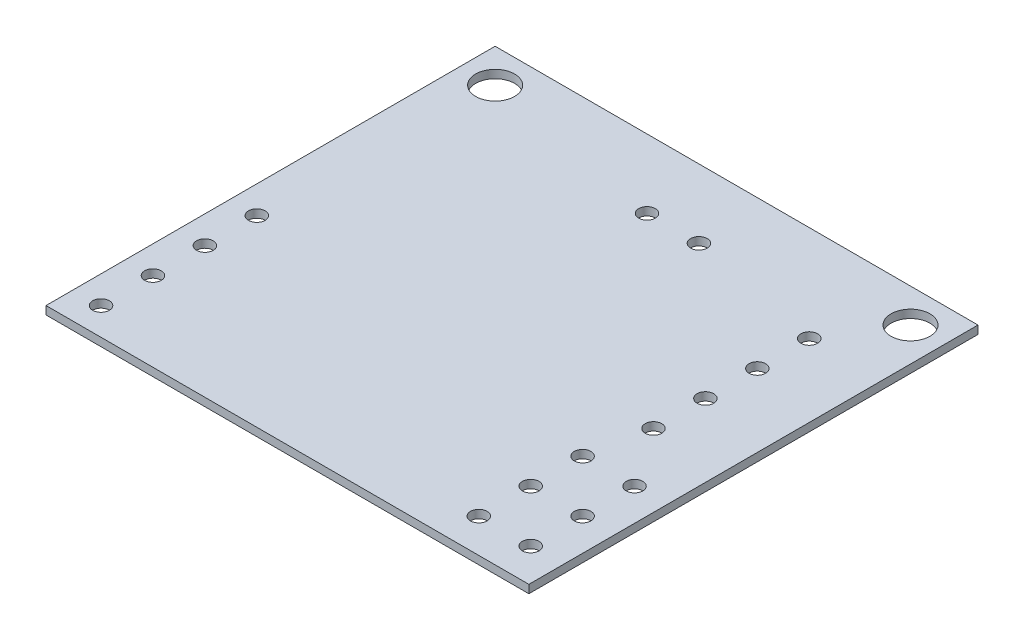
ISO-10303-21;
HEADER;
FILE_DESCRIPTION(('STEP AP214'),'2;1');
FILE_NAME('part.step','',(''),(''),'','','');
FILE_SCHEMA(('AUTOMOTIVE_DESIGN { 1 0 10303 214 1 1 1 1 }'));
ENDSEC;
DATA;
#1=APPLICATION_CONTEXT('core data for automotive mechanical design processes');
#2=APPLICATION_PROTOCOL_DEFINITION('international standard','automotive_design',2000,#1);
#3=PRODUCT_CONTEXT('',#1,'mechanical');
#4=PRODUCT('Part','Part','',(#3));
#5=PRODUCT_RELATED_PRODUCT_CATEGORY('part','',(#4));
#6=PRODUCT_DEFINITION_FORMATION('','',#4);
#7=PRODUCT_DEFINITION_CONTEXT('part definition',#1,'design');
#8=PRODUCT_DEFINITION('design','',#6,#7);
#9=PRODUCT_DEFINITION_SHAPE('','',#8);
#10=(LENGTH_UNIT() NAMED_UNIT(*) SI_UNIT(.MILLI.,.METRE.));
#11=(NAMED_UNIT(*) PLANE_ANGLE_UNIT() SI_UNIT($,.RADIAN.));
#12=(NAMED_UNIT(*) SI_UNIT($,.STERADIAN.) SOLID_ANGLE_UNIT());
#13=UNCERTAINTY_MEASURE_WITH_UNIT(LENGTH_MEASURE(1.E-05),#10,'distance_accuracy_value','');
#14=(GEOMETRIC_REPRESENTATION_CONTEXT(3) GLOBAL_UNCERTAINTY_ASSIGNED_CONTEXT((#13)) GLOBAL_UNIT_ASSIGNED_CONTEXT((#10,
#11,#12)) REPRESENTATION_CONTEXT('',''));
#15=CARTESIAN_POINT('',(0.,0.,0.));
#16=DIRECTION('',(0.,0.,1.));
#17=DIRECTION('',(1.,0.,0.));
#18=AXIS2_PLACEMENT_3D('',#15,#16,#17);
#19=CARTESIAN_POINT('',(0.,0.4,0.));
#20=DIRECTION('',(0.,-1.,0.));
#21=DIRECTION('',(0.,0.,-1.));
#22=AXIS2_PLACEMENT_3D('',#19,#20,#21);
#23=PLANE('',#22);
#24=DIRECTION('',(0.,0.,1.));
#25=VECTOR('',#24,1.);
#26=CARTESIAN_POINT('',(0.,0.4,0.));
#27=LINE('',#26,#25);
#28=CARTESIAN_POINT('',(0.,0.4,-21.971));
#29=VERTEX_POINT('',#28);
#30=CARTESIAN_POINT('',(0.,0.4,0.));
#31=VERTEX_POINT('',#30);
#32=EDGE_CURVE('E87',#29,#31,#27,.T.);
#33=ORIENTED_EDGE('',*,*,#32,.T.);
#34=DIRECTION('',(1.,0.,0.));
#35=VECTOR('',#34,1.);
#36=CARTESIAN_POINT('',(0.,0.4,0.));
#37=LINE('',#36,#35);
#38=CARTESIAN_POINT('',(23.622,0.4,0.));
#39=VERTEX_POINT('',#38);
#40=EDGE_CURVE('E82',#31,#39,#37,.T.);
#41=ORIENTED_EDGE('',*,*,#40,.T.);
#42=DIRECTION('',(0.,0.,-1.));
#43=VECTOR('',#42,1.);
#44=CARTESIAN_POINT('',(23.622,0.4,0.));
#45=LINE('',#44,#43);
#46=CARTESIAN_POINT('',(23.622,0.4,-21.971));
#47=VERTEX_POINT('',#46);
#48=EDGE_CURVE('E85',#39,#47,#45,.T.);
#49=ORIENTED_EDGE('',*,*,#48,.T.);
#50=DIRECTION('',(-1.,0.,0.));
#51=VECTOR('',#50,1.);
#52=CARTESIAN_POINT('',(0.,0.4,-21.971));
#53=LINE('',#52,#51);
#54=EDGE_CURVE('E52',#47,#29,#53,.T.);
#55=ORIENTED_EDGE('',*,*,#54,.T.);
#56=EDGE_LOOP('',(#33,#41,#49,#55));
#57=FACE_BOUND('',#56,.T.);
#58=CARTESIAN_POINT('',(1.651,0.4,-20.32));
#59=DIRECTION('',(0.,1.,0.));
#60=DIRECTION('',(0.,0.,1.));
#61=AXIS2_PLACEMENT_3D('',#58,#59,#60);
#62=CIRCLE('',#61,0.9525);
#63=CARTESIAN_POINT('',(1.651,0.4,-19.3675));
#64=VERTEX_POINT('',#63);
#65=EDGE_CURVE('E102',#64,#64,#62,.T.);
#66=ORIENTED_EDGE('',*,*,#65,.F.);
#67=EDGE_LOOP('',(#66));
#68=FACE_BOUND('',#67,.T.);
#69=CARTESIAN_POINT('',(21.971,0.4,-20.32));
#70=DIRECTION('',(0.,1.,0.));
#71=DIRECTION('',(0.,0.,1.));
#72=AXIS2_PLACEMENT_3D('',#69,#70,#71);
#73=CIRCLE('',#72,0.9525);
#74=CARTESIAN_POINT('',(21.971,0.4,-19.3675));
#75=VERTEX_POINT('',#74);
#76=EDGE_CURVE('E117',#75,#75,#73,.T.);
#77=ORIENTED_EDGE('',*,*,#76,.F.);
#78=EDGE_LOOP('',(#77));
#79=FACE_BOUND('',#78,.T.);
#80=CARTESIAN_POINT('',(13.335,0.4,-18.6055));
#81=DIRECTION('',(0.,1.,0.));
#82=DIRECTION('',(0.,0.,1.));
#83=AXIS2_PLACEMENT_3D('',#80,#81,#82);
#84=CIRCLE('',#83,0.406399999999999);
#85=CARTESIAN_POINT('',(13.335,0.4,-18.1991));
#86=VERTEX_POINT('',#85);
#87=EDGE_CURVE('E123',#86,#86,#84,.T.);
#88=ORIENTED_EDGE('',*,*,#87,.F.);
#89=EDGE_LOOP('',(#88));
#90=FACE_BOUND('',#89,.T.);
#91=CARTESIAN_POINT('',(10.795,0.4,-18.6055));
#92=DIRECTION('',(0.,1.,0.));
#93=DIRECTION('',(0.,0.,1.));
#94=AXIS2_PLACEMENT_3D('',#91,#92,#93);
#95=CIRCLE('',#94,0.406399999999999);
#96=CARTESIAN_POINT('',(10.795,0.4,-18.1991));
#97=VERTEX_POINT('',#96);
#98=EDGE_CURVE('E129',#97,#97,#95,.T.);
#99=ORIENTED_EDGE('',*,*,#98,.F.);
#100=EDGE_LOOP('',(#99));
#101=FACE_BOUND('',#100,.T.);
#102=CARTESIAN_POINT('',(1.3462,0.4,-8.9662));
#103=DIRECTION('',(0.,1.,0.));
#104=DIRECTION('',(0.,0.,1.));
#105=AXIS2_PLACEMENT_3D('',#102,#103,#104);
#106=CIRCLE('',#105,0.4064);
#107=CARTESIAN_POINT('',(1.3462,0.4,-8.5598));
#108=VERTEX_POINT('',#107);
#109=EDGE_CURVE('E135',#108,#108,#106,.T.);
#110=ORIENTED_EDGE('',*,*,#109,.F.);
#111=EDGE_LOOP('',(#110));
#112=FACE_BOUND('',#111,.T.);
#113=CARTESIAN_POINT('',(1.34620000000003,0.4,-6.4262));
#114=DIRECTION('',(0.,1.,0.));
#115=DIRECTION('',(0.,0.,1.));
#116=AXIS2_PLACEMENT_3D('',#113,#114,#115);
#117=CIRCLE('',#116,0.4064);
#118=CARTESIAN_POINT('',(1.34620000000003,0.4,-6.0198));
#119=VERTEX_POINT('',#118);
#120=EDGE_CURVE('E141',#119,#119,#117,.T.);
#121=ORIENTED_EDGE('',*,*,#120,.F.);
#122=EDGE_LOOP('',(#121));
#123=FACE_BOUND('',#122,.T.);
#124=CARTESIAN_POINT('',(1.34620000000005,0.4,-3.8862));
#125=DIRECTION('',(0.,1.,0.));
#126=DIRECTION('',(0.,0.,1.));
#127=AXIS2_PLACEMENT_3D('',#124,#125,#126);
#128=CIRCLE('',#127,0.4064);
#129=CARTESIAN_POINT('',(1.34620000000005,0.4,-3.4798));
#130=VERTEX_POINT('',#129);
#131=EDGE_CURVE('E147',#130,#130,#128,.T.);
#132=ORIENTED_EDGE('',*,*,#131,.F.);
#133=EDGE_LOOP('',(#132));
#134=FACE_BOUND('',#133,.T.);
#135=CARTESIAN_POINT('',(1.34620000000008,0.4,-1.3462));
#136=DIRECTION('',(0.,1.,0.));
#137=DIRECTION('',(0.,0.,1.));
#138=AXIS2_PLACEMENT_3D('',#135,#136,#137);
#139=CIRCLE('',#138,0.4064);
#140=CARTESIAN_POINT('',(1.34620000000008,0.4,-0.939799999999999));
#141=VERTEX_POINT('',#140);
#142=EDGE_CURVE('E153',#141,#141,#139,.T.);
#143=ORIENTED_EDGE('',*,*,#142,.F.);
#144=EDGE_LOOP('',(#143));
#145=FACE_BOUND('',#144,.T.);
#146=CARTESIAN_POINT('',(22.0472,0.4,-1.6637));
#147=DIRECTION('',(0.,1.,0.));
#148=DIRECTION('',(0.,0.,1.));
#149=AXIS2_PLACEMENT_3D('',#146,#147,#148);
#150=CIRCLE('',#149,0.406400000000001);
#151=CARTESIAN_POINT('',(22.0472,0.4,-1.2573));
#152=VERTEX_POINT('',#151);
#153=EDGE_CURVE('E159',#152,#152,#150,.T.);
#154=ORIENTED_EDGE('',*,*,#153,.F.);
#155=EDGE_LOOP('',(#154));
#156=FACE_BOUND('',#155,.T.);
#157=CARTESIAN_POINT('',(20.066,0.4,-9.652));
#158=DIRECTION('',(0.,1.,0.));
#159=DIRECTION('',(0.,0.,1.));
#160=AXIS2_PLACEMENT_3D('',#157,#158,#159);
#161=CIRCLE('',#160,0.406400000000001);
#162=CARTESIAN_POINT('',(20.066,0.4,-9.2456));
#163=VERTEX_POINT('',#162);
#164=EDGE_CURVE('E165',#163,#163,#161,.T.);
#165=ORIENTED_EDGE('',*,*,#164,.F.);
#166=EDGE_LOOP('',(#165));
#167=FACE_BOUND('',#166,.T.);
#168=CARTESIAN_POINT('',(19.5072,0.4,-1.66369999999998));
#169=DIRECTION('',(0.,1.,0.));
#170=DIRECTION('',(0.,0.,1.));
#171=AXIS2_PLACEMENT_3D('',#168,#169,#170);
#172=CIRCLE('',#171,0.406400000000001);
#173=CARTESIAN_POINT('',(19.5072,0.4,-1.25729999999998));
#174=VERTEX_POINT('',#173);
#175=EDGE_CURVE('E171',#174,#174,#172,.T.);
#176=ORIENTED_EDGE('',*,*,#175,.F.);
#177=EDGE_LOOP('',(#176));
#178=FACE_BOUND('',#177,.T.);
#179=CARTESIAN_POINT('',(19.5072,0.4,-4.20369999999998));
#180=DIRECTION('',(0.,1.,0.));
#181=DIRECTION('',(0.,0.,1.));
#182=AXIS2_PLACEMENT_3D('',#179,#180,#181);
#183=CIRCLE('',#182,0.406400000000001);
#184=CARTESIAN_POINT('',(19.5072,0.4,-3.79729999999998));
#185=VERTEX_POINT('',#184);
#186=EDGE_CURVE('E177',#185,#185,#183,.T.);
#187=ORIENTED_EDGE('',*,*,#186,.F.);
#188=EDGE_LOOP('',(#187));
#189=FACE_BOUND('',#188,.T.);
#190=CARTESIAN_POINT('',(19.5072,0.4,-6.74369999999998));
#191=DIRECTION('',(0.,1.,0.));
#192=DIRECTION('',(0.,0.,1.));
#193=AXIS2_PLACEMENT_3D('',#190,#191,#192);
#194=CIRCLE('',#193,0.406400000000001);
#195=CARTESIAN_POINT('',(19.5072,0.4,-6.33729999999998));
#196=VERTEX_POINT('',#195);
#197=EDGE_CURVE('E183',#196,#196,#194,.T.);
#198=ORIENTED_EDGE('',*,*,#197,.F.);
#199=EDGE_LOOP('',(#198));
#200=FACE_BOUND('',#199,.T.);
#201=CARTESIAN_POINT('',(22.0472,0.4,-4.2037));
#202=DIRECTION('',(0.,1.,0.));
#203=DIRECTION('',(0.,0.,1.));
#204=AXIS2_PLACEMENT_3D('',#201,#202,#203);
#205=CIRCLE('',#204,0.406400000000001);
#206=CARTESIAN_POINT('',(22.0472,0.4,-3.7973));
#207=VERTEX_POINT('',#206);
#208=EDGE_CURVE('E189',#207,#207,#205,.T.);
#209=ORIENTED_EDGE('',*,*,#208,.F.);
#210=EDGE_LOOP('',(#209));
#211=FACE_BOUND('',#210,.T.);
#212=CARTESIAN_POINT('',(22.0472,0.4,-6.7437));
#213=DIRECTION('',(0.,1.,0.));
#214=DIRECTION('',(0.,0.,1.));
#215=AXIS2_PLACEMENT_3D('',#212,#213,#214);
#216=CIRCLE('',#215,0.406400000000001);
#217=CARTESIAN_POINT('',(22.0472,0.4,-6.3373));
#218=VERTEX_POINT('',#217);
#219=EDGE_CURVE('E195',#218,#218,#216,.T.);
#220=ORIENTED_EDGE('',*,*,#219,.F.);
#221=EDGE_LOOP('',(#220));
#222=FACE_BOUND('',#221,.T.);
#223=CARTESIAN_POINT('',(20.066,0.4,-12.192));
#224=DIRECTION('',(0.,1.,0.));
#225=DIRECTION('',(0.,0.,1.));
#226=AXIS2_PLACEMENT_3D('',#223,#224,#225);
#227=CIRCLE('',#226,0.406400000000001);
#228=CARTESIAN_POINT('',(20.066,0.4,-11.7856));
#229=VERTEX_POINT('',#228);
#230=EDGE_CURVE('E201',#229,#229,#227,.T.);
#231=ORIENTED_EDGE('',*,*,#230,.F.);
#232=EDGE_LOOP('',(#231));
#233=FACE_BOUND('',#232,.T.);
#234=CARTESIAN_POINT('',(20.066,0.4,-14.732));
#235=DIRECTION('',(0.,1.,0.));
#236=DIRECTION('',(0.,0.,1.));
#237=AXIS2_PLACEMENT_3D('',#234,#235,#236);
#238=CIRCLE('',#237,0.406400000000002);
#239=CARTESIAN_POINT('',(20.066,0.4,-14.3256));
#240=VERTEX_POINT('',#239);
#241=EDGE_CURVE('E207',#240,#240,#238,.T.);
#242=ORIENTED_EDGE('',*,*,#241,.F.);
#243=EDGE_LOOP('',(#242));
#244=FACE_BOUND('',#243,.T.);
#245=CARTESIAN_POINT('',(20.066,0.4,-17.272));
#246=DIRECTION('',(0.,1.,0.));
#247=DIRECTION('',(0.,0.,1.));
#248=AXIS2_PLACEMENT_3D('',#245,#246,#247);
#249=CIRCLE('',#248,0.406400000000002);
#250=CARTESIAN_POINT('',(20.066,0.4,-16.8656));
#251=VERTEX_POINT('',#250);
#252=EDGE_CURVE('E213',#251,#251,#249,.T.);
#253=ORIENTED_EDGE('',*,*,#252,.F.);
#254=EDGE_LOOP('',(#253));
#255=FACE_BOUND('',#254,.T.);
#256=ADVANCED_FACE('F35',(#57,#68,#79,#90,#101,#112,#123,#134,#145,#156,#167,#178,#189,#200,
#211,#222,#233,#244,#255),#23,.F.);
#257=CARTESIAN_POINT('',(0.,0.,0.));
#258=DIRECTION('',(0.,-1.,0.));
#259=DIRECTION('',(0.,0.,-1.));
#260=AXIS2_PLACEMENT_3D('',#257,#258,#259);
#261=PLANE('',#260);
#262=CARTESIAN_POINT('',(20.066,0.,-14.732));
#263=DIRECTION('',(0.,1.,0.));
#264=DIRECTION('',(0.,0.,1.));
#265=AXIS2_PLACEMENT_3D('',#262,#263,#264);
#266=CIRCLE('',#265,0.406400000000002);
#267=CARTESIAN_POINT('',(20.066,0.,-14.3256));
#268=VERTEX_POINT('',#267);
#269=EDGE_CURVE('E210',#268,#268,#266,.T.);
#270=ORIENTED_EDGE('',*,*,#269,.T.);
#271=EDGE_LOOP('',(#270));
#272=FACE_BOUND('',#271,.T.);
#273=CARTESIAN_POINT('',(22.0472,0.,-6.7437));
#274=DIRECTION('',(0.,1.,0.));
#275=DIRECTION('',(0.,0.,1.));
#276=AXIS2_PLACEMENT_3D('',#273,#274,#275);
#277=CIRCLE('',#276,0.406400000000001);
#278=CARTESIAN_POINT('',(22.0472,0.,-6.3373));
#279=VERTEX_POINT('',#278);
#280=EDGE_CURVE('E198',#279,#279,#277,.T.);
#281=ORIENTED_EDGE('',*,*,#280,.T.);
#282=EDGE_LOOP('',(#281));
#283=FACE_BOUND('',#282,.T.);
#284=CARTESIAN_POINT('',(19.5072,0.,-6.74369999999998));
#285=DIRECTION('',(0.,1.,0.));
#286=DIRECTION('',(0.,0.,1.));
#287=AXIS2_PLACEMENT_3D('',#284,#285,#286);
#288=CIRCLE('',#287,0.406400000000001);
#289=CARTESIAN_POINT('',(19.5072,0.,-6.33729999999998));
#290=VERTEX_POINT('',#289);
#291=EDGE_CURVE('E186',#290,#290,#288,.T.);
#292=ORIENTED_EDGE('',*,*,#291,.T.);
#293=EDGE_LOOP('',(#292));
#294=FACE_BOUND('',#293,.T.);
#295=CARTESIAN_POINT('',(19.5072,0.,-1.66369999999998));
#296=DIRECTION('',(0.,1.,0.));
#297=DIRECTION('',(0.,0.,1.));
#298=AXIS2_PLACEMENT_3D('',#295,#296,#297);
#299=CIRCLE('',#298,0.406400000000001);
#300=CARTESIAN_POINT('',(19.5072,0.,-1.25729999999998));
#301=VERTEX_POINT('',#300);
#302=EDGE_CURVE('E174',#301,#301,#299,.T.);
#303=ORIENTED_EDGE('',*,*,#302,.T.);
#304=EDGE_LOOP('',(#303));
#305=FACE_BOUND('',#304,.T.);
#306=CARTESIAN_POINT('',(22.0472,0.,-1.6637));
#307=DIRECTION('',(0.,1.,0.));
#308=DIRECTION('',(0.,0.,1.));
#309=AXIS2_PLACEMENT_3D('',#306,#307,#308);
#310=CIRCLE('',#309,0.406400000000001);
#311=CARTESIAN_POINT('',(22.0472,0.,-1.2573));
#312=VERTEX_POINT('',#311);
#313=EDGE_CURVE('E162',#312,#312,#310,.T.);
#314=ORIENTED_EDGE('',*,*,#313,.T.);
#315=EDGE_LOOP('',(#314));
#316=FACE_BOUND('',#315,.T.);
#317=CARTESIAN_POINT('',(1.34620000000005,0.,-3.8862));
#318=DIRECTION('',(0.,1.,0.));
#319=DIRECTION('',(0.,0.,1.));
#320=AXIS2_PLACEMENT_3D('',#317,#318,#319);
#321=CIRCLE('',#320,0.4064);
#322=CARTESIAN_POINT('',(1.34620000000005,0.,-3.4798));
#323=VERTEX_POINT('',#322);
#324=EDGE_CURVE('E150',#323,#323,#321,.T.);
#325=ORIENTED_EDGE('',*,*,#324,.T.);
#326=EDGE_LOOP('',(#325));
#327=FACE_BOUND('',#326,.T.);
#328=CARTESIAN_POINT('',(1.3462,0.,-8.9662));
#329=DIRECTION('',(0.,1.,0.));
#330=DIRECTION('',(0.,0.,1.));
#331=AXIS2_PLACEMENT_3D('',#328,#329,#330);
#332=CIRCLE('',#331,0.4064);
#333=CARTESIAN_POINT('',(1.3462,0.,-8.5598));
#334=VERTEX_POINT('',#333);
#335=EDGE_CURVE('E138',#334,#334,#332,.T.);
#336=ORIENTED_EDGE('',*,*,#335,.T.);
#337=EDGE_LOOP('',(#336));
#338=FACE_BOUND('',#337,.T.);
#339=CARTESIAN_POINT('',(13.335,0.,-18.6055));
#340=DIRECTION('',(0.,1.,0.));
#341=DIRECTION('',(0.,0.,1.));
#342=AXIS2_PLACEMENT_3D('',#339,#340,#341);
#343=CIRCLE('',#342,0.406399999999999);
#344=CARTESIAN_POINT('',(13.335,0.,-18.1991));
#345=VERTEX_POINT('',#344);
#346=EDGE_CURVE('E126',#345,#345,#343,.T.);
#347=ORIENTED_EDGE('',*,*,#346,.T.);
#348=EDGE_LOOP('',(#347));
#349=FACE_BOUND('',#348,.T.);
#350=CARTESIAN_POINT('',(1.651,0.,-20.32));
#351=DIRECTION('',(0.,1.,0.));
#352=DIRECTION('',(0.,0.,1.));
#353=AXIS2_PLACEMENT_3D('',#350,#351,#352);
#354=CIRCLE('',#353,0.9525);
#355=CARTESIAN_POINT('',(1.651,0.,-19.3675));
#356=VERTEX_POINT('',#355);
#357=EDGE_CURVE('E114',#356,#356,#354,.T.);
#358=ORIENTED_EDGE('',*,*,#357,.T.);
#359=EDGE_LOOP('',(#358));
#360=FACE_BOUND('',#359,.T.);
#361=DIRECTION('',(0.,0.,1.));
#362=VECTOR('',#361,1.);
#363=CARTESIAN_POINT('',(0.,0.,0.));
#364=LINE('',#363,#362);
#365=CARTESIAN_POINT('',(0.,0.,-21.971));
#366=VERTEX_POINT('',#365);
#367=CARTESIAN_POINT('',(0.,0.,0.));
#368=VERTEX_POINT('',#367);
#369=EDGE_CURVE('E99',#366,#368,#364,.T.);
#370=ORIENTED_EDGE('',*,*,#369,.F.);
#371=DIRECTION('',(-1.,0.,0.));
#372=VECTOR('',#371,1.);
#373=CARTESIAN_POINT('',(0.,0.,-21.971));
#374=LINE('',#373,#372);
#375=CARTESIAN_POINT('',(23.622,0.,-21.971));
#376=VERTEX_POINT('',#375);
#377=EDGE_CURVE('E75',#376,#366,#374,.T.);
#378=ORIENTED_EDGE('',*,*,#377,.F.);
#379=DIRECTION('',(0.,0.,-1.));
#380=VECTOR('',#379,1.);
#381=CARTESIAN_POINT('',(23.622,0.,0.));
#382=LINE('',#381,#380);
#383=CARTESIAN_POINT('',(23.622,0.,0.));
#384=VERTEX_POINT('',#383);
#385=EDGE_CURVE('E69',#384,#376,#382,.T.);
#386=ORIENTED_EDGE('',*,*,#385,.F.);
#387=DIRECTION('',(1.,0.,0.));
#388=VECTOR('',#387,1.);
#389=CARTESIAN_POINT('',(0.,0.,0.));
#390=LINE('',#389,#388);
#391=EDGE_CURVE('E91',#368,#384,#390,.T.);
#392=ORIENTED_EDGE('',*,*,#391,.F.);
#393=EDGE_LOOP('',(#370,#378,#386,#392));
#394=FACE_BOUND('',#393,.T.);
#395=CARTESIAN_POINT('',(21.971,0.,-20.32));
#396=DIRECTION('',(0.,1.,0.));
#397=DIRECTION('',(0.,0.,1.));
#398=AXIS2_PLACEMENT_3D('',#395,#396,#397);
#399=CIRCLE('',#398,0.9525);
#400=CARTESIAN_POINT('',(21.971,0.,-19.3675));
#401=VERTEX_POINT('',#400);
#402=EDGE_CURVE('E120',#401,#401,#399,.T.);
#403=ORIENTED_EDGE('',*,*,#402,.T.);
#404=EDGE_LOOP('',(#403));
#405=FACE_BOUND('',#404,.T.);
#406=CARTESIAN_POINT('',(10.795,0.,-18.6055));
#407=DIRECTION('',(0.,1.,0.));
#408=DIRECTION('',(0.,0.,1.));
#409=AXIS2_PLACEMENT_3D('',#406,#407,#408);
#410=CIRCLE('',#409,0.406399999999999);
#411=CARTESIAN_POINT('',(10.795,0.,-18.1991));
#412=VERTEX_POINT('',#411);
#413=EDGE_CURVE('E132',#412,#412,#410,.T.);
#414=ORIENTED_EDGE('',*,*,#413,.T.);
#415=EDGE_LOOP('',(#414));
#416=FACE_BOUND('',#415,.T.);
#417=CARTESIAN_POINT('',(1.34620000000003,0.,-6.4262));
#418=DIRECTION('',(0.,1.,0.));
#419=DIRECTION('',(0.,0.,1.));
#420=AXIS2_PLACEMENT_3D('',#417,#418,#419);
#421=CIRCLE('',#420,0.4064);
#422=CARTESIAN_POINT('',(1.34620000000003,0.,-6.0198));
#423=VERTEX_POINT('',#422);
#424=EDGE_CURVE('E144',#423,#423,#421,.T.);
#425=ORIENTED_EDGE('',*,*,#424,.T.);
#426=EDGE_LOOP('',(#425));
#427=FACE_BOUND('',#426,.T.);
#428=CARTESIAN_POINT('',(1.34620000000008,0.,-1.3462));
#429=DIRECTION('',(0.,1.,0.));
#430=DIRECTION('',(0.,0.,1.));
#431=AXIS2_PLACEMENT_3D('',#428,#429,#430);
#432=CIRCLE('',#431,0.4064);
#433=CARTESIAN_POINT('',(1.34620000000008,0.,-0.939799999999999));
#434=VERTEX_POINT('',#433);
#435=EDGE_CURVE('E156',#434,#434,#432,.T.);
#436=ORIENTED_EDGE('',*,*,#435,.T.);
#437=EDGE_LOOP('',(#436));
#438=FACE_BOUND('',#437,.T.);
#439=CARTESIAN_POINT('',(20.066,0.,-9.652));
#440=DIRECTION('',(0.,1.,0.));
#441=DIRECTION('',(0.,0.,1.));
#442=AXIS2_PLACEMENT_3D('',#439,#440,#441);
#443=CIRCLE('',#442,0.406400000000001);
#444=CARTESIAN_POINT('',(20.066,0.,-9.2456));
#445=VERTEX_POINT('',#444);
#446=EDGE_CURVE('E168',#445,#445,#443,.T.);
#447=ORIENTED_EDGE('',*,*,#446,.T.);
#448=EDGE_LOOP('',(#447));
#449=FACE_BOUND('',#448,.T.);
#450=CARTESIAN_POINT('',(19.5072,0.,-4.20369999999998));
#451=DIRECTION('',(0.,1.,0.));
#452=DIRECTION('',(0.,0.,1.));
#453=AXIS2_PLACEMENT_3D('',#450,#451,#452);
#454=CIRCLE('',#453,0.406400000000001);
#455=CARTESIAN_POINT('',(19.5072,0.,-3.79729999999998));
#456=VERTEX_POINT('',#455);
#457=EDGE_CURVE('E180',#456,#456,#454,.T.);
#458=ORIENTED_EDGE('',*,*,#457,.T.);
#459=EDGE_LOOP('',(#458));
#460=FACE_BOUND('',#459,.T.);
#461=CARTESIAN_POINT('',(22.0472,0.,-4.2037));
#462=DIRECTION('',(0.,1.,0.));
#463=DIRECTION('',(0.,0.,1.));
#464=AXIS2_PLACEMENT_3D('',#461,#462,#463);
#465=CIRCLE('',#464,0.406400000000001);
#466=CARTESIAN_POINT('',(22.0472,0.,-3.7973));
#467=VERTEX_POINT('',#466);
#468=EDGE_CURVE('E192',#467,#467,#465,.T.);
#469=ORIENTED_EDGE('',*,*,#468,.T.);
#470=EDGE_LOOP('',(#469));
#471=FACE_BOUND('',#470,.T.);
#472=CARTESIAN_POINT('',(20.066,0.,-12.192));
#473=DIRECTION('',(0.,1.,0.));
#474=DIRECTION('',(0.,0.,1.));
#475=AXIS2_PLACEMENT_3D('',#472,#473,#474);
#476=CIRCLE('',#475,0.406400000000001);
#477=CARTESIAN_POINT('',(20.066,0.,-11.7856));
#478=VERTEX_POINT('',#477);
#479=EDGE_CURVE('E204',#478,#478,#476,.T.);
#480=ORIENTED_EDGE('',*,*,#479,.T.);
#481=EDGE_LOOP('',(#480));
#482=FACE_BOUND('',#481,.T.);
#483=CARTESIAN_POINT('',(20.066,0.,-17.272));
#484=DIRECTION('',(0.,1.,0.));
#485=DIRECTION('',(0.,0.,1.));
#486=AXIS2_PLACEMENT_3D('',#483,#484,#485);
#487=CIRCLE('',#486,0.406400000000002);
#488=CARTESIAN_POINT('',(20.066,0.,-16.8656));
#489=VERTEX_POINT('',#488);
#490=EDGE_CURVE('E216',#489,#489,#487,.T.);
#491=ORIENTED_EDGE('',*,*,#490,.T.);
#492=EDGE_LOOP('',(#491));
#493=FACE_BOUND('',#492,.T.);
#494=ADVANCED_FACE('F110',(#272,#283,#294,#305,#316,#327,#338,#349,#360,#394,#405,#416,#427,
#438,#449,#460,#471,#482,#493),#261,.T.);
#495=CARTESIAN_POINT('',(0.,0.4,0.));
#496=DIRECTION('',(1.,0.,0.));
#497=DIRECTION('',(0.,0.,-1.));
#498=AXIS2_PLACEMENT_3D('',#495,#496,#497);
#499=PLANE('',#498);
#500=ORIENTED_EDGE('',*,*,#369,.T.);
#501=DIRECTION('',(0.,-1.,0.));
#502=VECTOR('',#501,1.);
#503=CARTESIAN_POINT('',(0.,0.4,0.));
#504=LINE('',#503,#502);
#505=EDGE_CURVE('E11',#31,#368,#504,.T.);
#506=ORIENTED_EDGE('',*,*,#505,.F.);
#507=ORIENTED_EDGE('',*,*,#32,.F.);
#508=DIRECTION('',(0.,-1.,0.));
#509=VECTOR('',#508,1.);
#510=CARTESIAN_POINT('',(0.,0.4,-21.971));
#511=LINE('',#510,#509);
#512=EDGE_CURVE('E95',#29,#366,#511,.T.);
#513=ORIENTED_EDGE('',*,*,#512,.T.);
#514=EDGE_LOOP('',(#500,#506,#507,#513));
#515=FACE_BOUND('',#514,.T.);
#516=ADVANCED_FACE('F37',(#515),#499,.F.);
#517=CARTESIAN_POINT('',(0.,0.4,0.));
#518=DIRECTION('',(0.,0.,-1.));
#519=DIRECTION('',(-1.,0.,0.));
#520=AXIS2_PLACEMENT_3D('',#517,#518,#519);
#521=PLANE('',#520);
#522=ORIENTED_EDGE('',*,*,#391,.T.);
#523=DIRECTION('',(0.,-1.,0.));
#524=VECTOR('',#523,1.);
#525=CARTESIAN_POINT('',(23.622,0.4,0.));
#526=LINE('',#525,#524);
#527=EDGE_CURVE('E44',#39,#384,#526,.T.);
#528=ORIENTED_EDGE('',*,*,#527,.F.);
#529=ORIENTED_EDGE('',*,*,#40,.F.);
#530=ORIENTED_EDGE('',*,*,#505,.T.);
#531=EDGE_LOOP('',(#522,#528,#529,#530));
#532=FACE_BOUND('',#531,.T.);
#533=ADVANCED_FACE('F90',(#532),#521,.F.);
#534=CARTESIAN_POINT('',(23.622,0.4,0.));
#535=DIRECTION('',(-1.,0.,0.));
#536=DIRECTION('',(0.,0.,1.));
#537=AXIS2_PLACEMENT_3D('',#534,#535,#536);
#538=PLANE('',#537);
#539=ORIENTED_EDGE('',*,*,#385,.T.);
#540=DIRECTION('',(0.,-1.,0.));
#541=VECTOR('',#540,1.);
#542=CARTESIAN_POINT('',(23.622,0.4,-21.971));
#543=LINE('',#542,#541);
#544=EDGE_CURVE('E92',#47,#376,#543,.T.);
#545=ORIENTED_EDGE('',*,*,#544,.F.);
#546=ORIENTED_EDGE('',*,*,#48,.F.);
#547=ORIENTED_EDGE('',*,*,#527,.T.);
#548=EDGE_LOOP('',(#539,#545,#546,#547));
#549=FACE_BOUND('',#548,.T.);
#550=ADVANCED_FACE('F93',(#549),#538,.F.);
#551=CARTESIAN_POINT('',(0.,0.4,-21.971));
#552=DIRECTION('',(0.,0.,1.));
#553=DIRECTION('',(1.,0.,0.));
#554=AXIS2_PLACEMENT_3D('',#551,#552,#553);
#555=PLANE('',#554);
#556=ORIENTED_EDGE('',*,*,#377,.T.);
#557=ORIENTED_EDGE('',*,*,#512,.F.);
#558=ORIENTED_EDGE('',*,*,#54,.F.);
#559=ORIENTED_EDGE('',*,*,#544,.T.);
#560=EDGE_LOOP('',(#556,#557,#558,#559));
#561=FACE_BOUND('',#560,.T.);
#562=ADVANCED_FACE('F107',(#561),#555,.F.);
#563=CARTESIAN_POINT('',(1.651,0.4,-20.32));
#564=DIRECTION('',(0.,-1.,0.));
#565=DIRECTION('',(0.,0.,-1.));
#566=AXIS2_PLACEMENT_3D('',#563,#564,#565);
#567=CYLINDRICAL_SURFACE('',#566,0.9525);
#568=ORIENTED_EDGE('',*,*,#65,.T.);
#569=EDGE_LOOP('',(#568));
#570=FACE_BOUND('',#569,.T.);
#571=ORIENTED_EDGE('',*,*,#357,.F.);
#572=EDGE_LOOP('',(#571));
#573=FACE_BOUND('',#572,.T.);
#574=ADVANCED_FACE('F233',(#570,#573),#567,.F.);
#575=CARTESIAN_POINT('',(21.971,0.4,-20.32));
#576=DIRECTION('',(0.,-1.,0.));
#577=DIRECTION('',(0.,0.,-1.));
#578=AXIS2_PLACEMENT_3D('',#575,#576,#577);
#579=CYLINDRICAL_SURFACE('',#578,0.9525);
#580=ORIENTED_EDGE('',*,*,#76,.T.);
#581=EDGE_LOOP('',(#580));
#582=FACE_BOUND('',#581,.T.);
#583=ORIENTED_EDGE('',*,*,#402,.F.);
#584=EDGE_LOOP('',(#583));
#585=FACE_BOUND('',#584,.T.);
#586=ADVANCED_FACE('F283',(#582,#585),#579,.F.);
#587=CARTESIAN_POINT('',(13.335,0.4,-18.6055));
#588=DIRECTION('',(0.,-1.,0.));
#589=DIRECTION('',(0.,0.,-1.));
#590=AXIS2_PLACEMENT_3D('',#587,#588,#589);
#591=CYLINDRICAL_SURFACE('',#590,0.406399999999999);
#592=ORIENTED_EDGE('',*,*,#87,.T.);
#593=EDGE_LOOP('',(#592));
#594=FACE_BOUND('',#593,.T.);
#595=ORIENTED_EDGE('',*,*,#346,.F.);
#596=EDGE_LOOP('',(#595));
#597=FACE_BOUND('',#596,.T.);
#598=ADVANCED_FACE('F291',(#594,#597),#591,.F.);
#599=CARTESIAN_POINT('',(10.795,0.4,-18.6055));
#600=DIRECTION('',(0.,-1.,0.));
#601=DIRECTION('',(0.,0.,-1.));
#602=AXIS2_PLACEMENT_3D('',#599,#600,#601);
#603=CYLINDRICAL_SURFACE('',#602,0.406399999999999);
#604=ORIENTED_EDGE('',*,*,#98,.T.);
#605=EDGE_LOOP('',(#604));
#606=FACE_BOUND('',#605,.T.);
#607=ORIENTED_EDGE('',*,*,#413,.F.);
#608=EDGE_LOOP('',(#607));
#609=FACE_BOUND('',#608,.T.);
#610=ADVANCED_FACE('F299',(#606,#609),#603,.F.);
#611=CARTESIAN_POINT('',(1.3462,0.4,-8.9662));
#612=DIRECTION('',(0.,-1.,0.));
#613=DIRECTION('',(0.,0.,-1.));
#614=AXIS2_PLACEMENT_3D('',#611,#612,#613);
#615=CYLINDRICAL_SURFACE('',#614,0.4064);
#616=ORIENTED_EDGE('',*,*,#109,.T.);
#617=EDGE_LOOP('',(#616));
#618=FACE_BOUND('',#617,.T.);
#619=ORIENTED_EDGE('',*,*,#335,.F.);
#620=EDGE_LOOP('',(#619));
#621=FACE_BOUND('',#620,.T.);
#622=ADVANCED_FACE('F308',(#618,#621),#615,.F.);
#623=CARTESIAN_POINT('',(1.34620000000003,0.4,-6.4262));
#624=DIRECTION('',(0.,-1.,0.));
#625=DIRECTION('',(0.,0.,-1.));
#626=AXIS2_PLACEMENT_3D('',#623,#624,#625);
#627=CYLINDRICAL_SURFACE('',#626,0.4064);
#628=ORIENTED_EDGE('',*,*,#120,.T.);
#629=EDGE_LOOP('',(#628));
#630=FACE_BOUND('',#629,.T.);
#631=ORIENTED_EDGE('',*,*,#424,.F.);
#632=EDGE_LOOP('',(#631));
#633=FACE_BOUND('',#632,.T.);
#634=ADVANCED_FACE('F317',(#630,#633),#627,.F.);
#635=CARTESIAN_POINT('',(1.34620000000005,0.4,-3.8862));
#636=DIRECTION('',(0.,-1.,0.));
#637=DIRECTION('',(0.,0.,-1.));
#638=AXIS2_PLACEMENT_3D('',#635,#636,#637);
#639=CYLINDRICAL_SURFACE('',#638,0.4064);
#640=ORIENTED_EDGE('',*,*,#131,.T.);
#641=EDGE_LOOP('',(#640));
#642=FACE_BOUND('',#641,.T.);
#643=ORIENTED_EDGE('',*,*,#324,.F.);
#644=EDGE_LOOP('',(#643));
#645=FACE_BOUND('',#644,.T.);
#646=ADVANCED_FACE('F326',(#642,#645),#639,.F.);
#647=CARTESIAN_POINT('',(1.34620000000008,0.4,-1.3462));
#648=DIRECTION('',(0.,-1.,0.));
#649=DIRECTION('',(0.,0.,-1.));
#650=AXIS2_PLACEMENT_3D('',#647,#648,#649);
#651=CYLINDRICAL_SURFACE('',#650,0.4064);
#652=ORIENTED_EDGE('',*,*,#142,.T.);
#653=EDGE_LOOP('',(#652));
#654=FACE_BOUND('',#653,.T.);
#655=ORIENTED_EDGE('',*,*,#435,.F.);
#656=EDGE_LOOP('',(#655));
#657=FACE_BOUND('',#656,.T.);
#658=ADVANCED_FACE('F335',(#654,#657),#651,.F.);
#659=CARTESIAN_POINT('',(22.0472,0.4,-1.6637));
#660=DIRECTION('',(0.,-1.,0.));
#661=DIRECTION('',(0.,0.,-1.));
#662=AXIS2_PLACEMENT_3D('',#659,#660,#661);
#663=CYLINDRICAL_SURFACE('',#662,0.406400000000001);
#664=ORIENTED_EDGE('',*,*,#153,.T.);
#665=EDGE_LOOP('',(#664));
#666=FACE_BOUND('',#665,.T.);
#667=ORIENTED_EDGE('',*,*,#313,.F.);
#668=EDGE_LOOP('',(#667));
#669=FACE_BOUND('',#668,.T.);
#670=ADVANCED_FACE('F344',(#666,#669),#663,.F.);
#671=CARTESIAN_POINT('',(20.066,0.4,-9.652));
#672=DIRECTION('',(0.,-1.,0.));
#673=DIRECTION('',(0.,0.,-1.));
#674=AXIS2_PLACEMENT_3D('',#671,#672,#673);
#675=CYLINDRICAL_SURFACE('',#674,0.406400000000001);
#676=ORIENTED_EDGE('',*,*,#164,.T.);
#677=EDGE_LOOP('',(#676));
#678=FACE_BOUND('',#677,.T.);
#679=ORIENTED_EDGE('',*,*,#446,.F.);
#680=EDGE_LOOP('',(#679));
#681=FACE_BOUND('',#680,.T.);
#682=ADVANCED_FACE('F353',(#678,#681),#675,.F.);
#683=CARTESIAN_POINT('',(19.5072,0.4,-1.66369999999998));
#684=DIRECTION('',(0.,-1.,0.));
#685=DIRECTION('',(0.,0.,-1.));
#686=AXIS2_PLACEMENT_3D('',#683,#684,#685);
#687=CYLINDRICAL_SURFACE('',#686,0.406400000000001);
#688=ORIENTED_EDGE('',*,*,#175,.T.);
#689=EDGE_LOOP('',(#688));
#690=FACE_BOUND('',#689,.T.);
#691=ORIENTED_EDGE('',*,*,#302,.F.);
#692=EDGE_LOOP('',(#691));
#693=FACE_BOUND('',#692,.T.);
#694=ADVANCED_FACE('F362',(#690,#693),#687,.F.);
#695=CARTESIAN_POINT('',(19.5072,0.4,-4.20369999999998));
#696=DIRECTION('',(0.,-1.,0.));
#697=DIRECTION('',(0.,0.,-1.));
#698=AXIS2_PLACEMENT_3D('',#695,#696,#697);
#699=CYLINDRICAL_SURFACE('',#698,0.406400000000001);
#700=ORIENTED_EDGE('',*,*,#186,.T.);
#701=EDGE_LOOP('',(#700));
#702=FACE_BOUND('',#701,.T.);
#703=ORIENTED_EDGE('',*,*,#457,.F.);
#704=EDGE_LOOP('',(#703));
#705=FACE_BOUND('',#704,.T.);
#706=ADVANCED_FACE('F371',(#702,#705),#699,.F.);
#707=CARTESIAN_POINT('',(19.5072,0.4,-6.74369999999998));
#708=DIRECTION('',(0.,-1.,0.));
#709=DIRECTION('',(0.,0.,-1.));
#710=AXIS2_PLACEMENT_3D('',#707,#708,#709);
#711=CYLINDRICAL_SURFACE('',#710,0.406400000000001);
#712=ORIENTED_EDGE('',*,*,#197,.T.);
#713=EDGE_LOOP('',(#712));
#714=FACE_BOUND('',#713,.T.);
#715=ORIENTED_EDGE('',*,*,#291,.F.);
#716=EDGE_LOOP('',(#715));
#717=FACE_BOUND('',#716,.T.);
#718=ADVANCED_FACE('F380',(#714,#717),#711,.F.);
#719=CARTESIAN_POINT('',(22.0472,0.4,-4.2037));
#720=DIRECTION('',(0.,-1.,0.));
#721=DIRECTION('',(0.,0.,-1.));
#722=AXIS2_PLACEMENT_3D('',#719,#720,#721);
#723=CYLINDRICAL_SURFACE('',#722,0.406400000000001);
#724=ORIENTED_EDGE('',*,*,#208,.T.);
#725=EDGE_LOOP('',(#724));
#726=FACE_BOUND('',#725,.T.);
#727=ORIENTED_EDGE('',*,*,#468,.F.);
#728=EDGE_LOOP('',(#727));
#729=FACE_BOUND('',#728,.T.);
#730=ADVANCED_FACE('F389',(#726,#729),#723,.F.);
#731=CARTESIAN_POINT('',(22.0472,0.4,-6.7437));
#732=DIRECTION('',(0.,-1.,0.));
#733=DIRECTION('',(0.,0.,-1.));
#734=AXIS2_PLACEMENT_3D('',#731,#732,#733);
#735=CYLINDRICAL_SURFACE('',#734,0.406400000000001);
#736=ORIENTED_EDGE('',*,*,#219,.T.);
#737=EDGE_LOOP('',(#736));
#738=FACE_BOUND('',#737,.T.);
#739=ORIENTED_EDGE('',*,*,#280,.F.);
#740=EDGE_LOOP('',(#739));
#741=FACE_BOUND('',#740,.T.);
#742=ADVANCED_FACE('F398',(#738,#741),#735,.F.);
#743=CARTESIAN_POINT('',(20.066,0.4,-12.192));
#744=DIRECTION('',(0.,-1.,0.));
#745=DIRECTION('',(0.,0.,-1.));
#746=AXIS2_PLACEMENT_3D('',#743,#744,#745);
#747=CYLINDRICAL_SURFACE('',#746,0.406400000000001);
#748=ORIENTED_EDGE('',*,*,#230,.T.);
#749=EDGE_LOOP('',(#748));
#750=FACE_BOUND('',#749,.T.);
#751=ORIENTED_EDGE('',*,*,#479,.F.);
#752=EDGE_LOOP('',(#751));
#753=FACE_BOUND('',#752,.T.);
#754=ADVANCED_FACE('F407',(#750,#753),#747,.F.);
#755=CARTESIAN_POINT('',(20.066,0.4,-14.732));
#756=DIRECTION('',(0.,-1.,0.));
#757=DIRECTION('',(0.,0.,-1.));
#758=AXIS2_PLACEMENT_3D('',#755,#756,#757);
#759=CYLINDRICAL_SURFACE('',#758,0.406400000000002);
#760=ORIENTED_EDGE('',*,*,#241,.T.);
#761=EDGE_LOOP('',(#760));
#762=FACE_BOUND('',#761,.T.);
#763=ORIENTED_EDGE('',*,*,#269,.F.);
#764=EDGE_LOOP('',(#763));
#765=FACE_BOUND('',#764,.T.);
#766=ADVANCED_FACE('F416',(#762,#765),#759,.F.);
#767=CARTESIAN_POINT('',(20.066,0.4,-17.272));
#768=DIRECTION('',(0.,-1.,0.));
#769=DIRECTION('',(0.,0.,-1.));
#770=AXIS2_PLACEMENT_3D('',#767,#768,#769);
#771=CYLINDRICAL_SURFACE('',#770,0.406400000000002);
#772=ORIENTED_EDGE('',*,*,#252,.T.);
#773=EDGE_LOOP('',(#772));
#774=FACE_BOUND('',#773,.T.);
#775=ORIENTED_EDGE('',*,*,#490,.F.);
#776=EDGE_LOOP('',(#775));
#777=FACE_BOUND('',#776,.T.);
#778=ADVANCED_FACE('F222',(#774,#777),#771,.F.);
#779=CLOSED_SHELL('',(#256,#494,#516,#533,#550,#562,#574,#586,#598,#610,#622,#634,#646,#658,
#670,#682,#694,#706,#718,#730,#742,#754,#766,#778));
#780=MANIFOLD_SOLID_BREP('B2',#779);
#781=ADVANCED_BREP_SHAPE_REPRESENTATION('',(#18,#780),#14);
#782=SHAPE_DEFINITION_REPRESENTATION(#9,#781);
ENDSEC;
END-ISO-10303-21;
